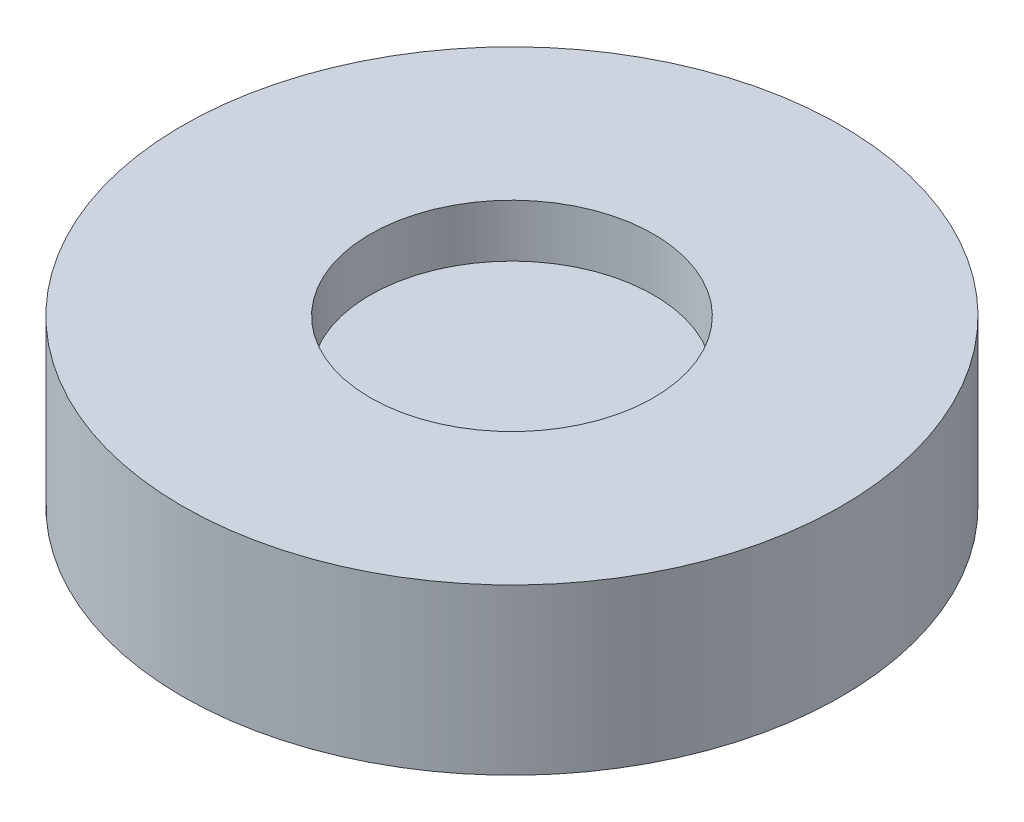
ISO-10303-21;
HEADER;
FILE_DESCRIPTION(('STEP AP214'),'2;1');
FILE_NAME('part.step','',(''),(''),'','','');
FILE_SCHEMA(('AUTOMOTIVE_DESIGN { 1 0 10303 214 1 1 1 1 }'));
ENDSEC;
DATA;
#1=APPLICATION_CONTEXT('core data for automotive mechanical design processes');
#2=APPLICATION_PROTOCOL_DEFINITION('international standard','automotive_design',2000,#1);
#3=PRODUCT_CONTEXT('',#1,'mechanical');
#4=PRODUCT('Part','Part','',(#3));
#5=PRODUCT_RELATED_PRODUCT_CATEGORY('part','',(#4));
#6=PRODUCT_DEFINITION_FORMATION('','',#4);
#7=PRODUCT_DEFINITION_CONTEXT('part definition',#1,'design');
#8=PRODUCT_DEFINITION('design','',#6,#7);
#9=PRODUCT_DEFINITION_SHAPE('','',#8);
#10=(LENGTH_UNIT() NAMED_UNIT(*) SI_UNIT(.MILLI.,.METRE.));
#11=(NAMED_UNIT(*) PLANE_ANGLE_UNIT() SI_UNIT($,.RADIAN.));
#12=(NAMED_UNIT(*) SI_UNIT($,.STERADIAN.) SOLID_ANGLE_UNIT());
#13=UNCERTAINTY_MEASURE_WITH_UNIT(LENGTH_MEASURE(1.E-05),#10,'distance_accuracy_value','');
#14=(GEOMETRIC_REPRESENTATION_CONTEXT(3) GLOBAL_UNCERTAINTY_ASSIGNED_CONTEXT((#13)) GLOBAL_UNIT_ASSIGNED_CONTEXT((#10,
#11,#12)) REPRESENTATION_CONTEXT('',''));
#15=CARTESIAN_POINT('',(0.,0.,0.));
#16=DIRECTION('',(0.,0.,1.));
#17=DIRECTION('',(1.,0.,0.));
#18=AXIS2_PLACEMENT_3D('',#15,#16,#17);
#19=CARTESIAN_POINT('',(0.,10.,0.));
#20=DIRECTION('',(0.,-1.,0.));
#21=DIRECTION('',(0.,0.,-1.));
#22=AXIS2_PLACEMENT_3D('',#19,#20,#21);
#23=CYLINDRICAL_SURFACE('',#22,20.);
#24=CARTESIAN_POINT('',(0.,10.,0.));
#25=DIRECTION('',(0.,1.,0.));
#26=DIRECTION('',(0.,0.,1.));
#27=AXIS2_PLACEMENT_3D('',#24,#25,#26);
#28=CIRCLE('',#27,20.);
#29=CARTESIAN_POINT('',(0.,10.,20.));
#30=VERTEX_POINT('',#29);
#31=EDGE_CURVE('E10',#30,#30,#28,.T.);
#32=ORIENTED_EDGE('',*,*,#31,.F.);
#33=EDGE_LOOP('',(#32));
#34=FACE_BOUND('',#33,.T.);
#35=CARTESIAN_POINT('',(0.,0.,0.));
#36=DIRECTION('',(0.,1.,0.));
#37=DIRECTION('',(0.,0.,1.));
#38=AXIS2_PLACEMENT_3D('',#35,#36,#37);
#39=CIRCLE('',#38,20.);
#40=CARTESIAN_POINT('',(0.,0.,20.));
#41=VERTEX_POINT('',#40);
#42=EDGE_CURVE('E34',#41,#41,#39,.T.);
#43=ORIENTED_EDGE('',*,*,#42,.T.);
#44=EDGE_LOOP('',(#43));
#45=FACE_BOUND('',#44,.T.);
#46=ADVANCED_FACE('F31',(#34,#45),#23,.T.);
#47=CARTESIAN_POINT('',(0.,10.,0.));
#48=DIRECTION('',(0.,1.,0.));
#49=DIRECTION('',(0.,0.,1.));
#50=AXIS2_PLACEMENT_3D('',#47,#48,#49);
#51=PLANE('',#50);
#52=CARTESIAN_POINT('',(0.,10.,0.));
#53=DIRECTION('',(0.,1.,0.));
#54=DIRECTION('',(0.,0.,1.));
#55=AXIS2_PLACEMENT_3D('',#52,#53,#54);
#56=CIRCLE('',#55,8.6);
#57=CARTESIAN_POINT('',(0.,10.,8.6));
#58=VERTEX_POINT('',#57);
#59=EDGE_CURVE('E43',#58,#58,#56,.T.);
#60=ORIENTED_EDGE('',*,*,#59,.F.);
#61=EDGE_LOOP('',(#60));
#62=FACE_BOUND('',#61,.T.);
#63=ORIENTED_EDGE('',*,*,#31,.T.);
#64=EDGE_LOOP('',(#63));
#65=FACE_BOUND('',#64,.T.);
#66=ADVANCED_FACE('F68',(#62,#65),#51,.T.);
#67=CARTESIAN_POINT('',(0.,0.,0.));
#68=DIRECTION('',(0.,1.,0.));
#69=DIRECTION('',(0.,0.,1.));
#70=AXIS2_PLACEMENT_3D('',#67,#68,#69);
#71=PLANE('',#70);
#72=CARTESIAN_POINT('',(0.,0.,0.));
#73=DIRECTION('',(0.,-1.,0.));
#74=DIRECTION('',(0.,0.,-1.));
#75=AXIS2_PLACEMENT_3D('',#72,#73,#74);
#76=CIRCLE('',#75,8.25);
#77=CARTESIAN_POINT('',(0.,0.,-8.25));
#78=VERTEX_POINT('',#77);
#79=EDGE_CURVE('E49',#78,#78,#76,.T.);
#80=ORIENTED_EDGE('',*,*,#79,.F.);
#81=EDGE_LOOP('',(#80));
#82=FACE_BOUND('',#81,.T.);
#83=ORIENTED_EDGE('',*,*,#42,.F.);
#84=EDGE_LOOP('',(#83));
#85=FACE_BOUND('',#84,.T.);
#86=ADVANCED_FACE('F64',(#82,#85),#71,.F.);
#87=CARTESIAN_POINT('',(0.,6.8,0.));
#88=DIRECTION('',(0.,1.,0.));
#89=DIRECTION('',(0.,0.,1.));
#90=AXIS2_PLACEMENT_3D('',#87,#88,#89);
#91=CYLINDRICAL_SURFACE('',#90,8.6);
#92=CARTESIAN_POINT('',(0.,6.8,0.));
#93=DIRECTION('',(0.,1.,0.));
#94=DIRECTION('',(0.,0.,1.));
#95=AXIS2_PLACEMENT_3D('',#92,#93,#94);
#96=CIRCLE('',#95,8.6);
#97=CARTESIAN_POINT('',(0.,6.8,8.6));
#98=VERTEX_POINT('',#97);
#99=EDGE_CURVE('E41',#98,#98,#96,.T.);
#100=ORIENTED_EDGE('',*,*,#99,.F.);
#101=EDGE_LOOP('',(#100));
#102=FACE_BOUND('',#101,.T.);
#103=ORIENTED_EDGE('',*,*,#59,.T.);
#104=EDGE_LOOP('',(#103));
#105=FACE_BOUND('',#104,.T.);
#106=ADVANCED_FACE('F67',(#102,#105),#91,.F.);
#107=CARTESIAN_POINT('',(0.,6.8,0.));
#108=DIRECTION('',(0.,1.,0.));
#109=DIRECTION('',(0.,0.,1.));
#110=AXIS2_PLACEMENT_3D('',#107,#108,#109);
#111=PLANE('',#110);
#112=ORIENTED_EDGE('',*,*,#99,.T.);
#113=EDGE_LOOP('',(#112));
#114=FACE_BOUND('',#113,.T.);
#115=ADVANCED_FACE('F60',(#114),#111,.T.);
#116=CARTESIAN_POINT('',(0.,1.8,0.));
#117=DIRECTION('',(0.,-1.,0.));
#118=DIRECTION('',(0.,0.,-1.));
#119=AXIS2_PLACEMENT_3D('',#116,#117,#118);
#120=CYLINDRICAL_SURFACE('',#119,8.25);
#121=CARTESIAN_POINT('',(0.,1.8,0.));
#122=DIRECTION('',(0.,-1.,0.));
#123=DIRECTION('',(0.,0.,-1.));
#124=AXIS2_PLACEMENT_3D('',#121,#122,#123);
#125=CIRCLE('',#124,8.25);
#126=CARTESIAN_POINT('',(0.,1.8,-8.25));
#127=VERTEX_POINT('',#126);
#128=EDGE_CURVE('E46',#127,#127,#125,.T.);
#129=ORIENTED_EDGE('',*,*,#128,.F.);
#130=EDGE_LOOP('',(#129));
#131=FACE_BOUND('',#130,.T.);
#132=ORIENTED_EDGE('',*,*,#79,.T.);
#133=EDGE_LOOP('',(#132));
#134=FACE_BOUND('',#133,.T.);
#135=ADVANCED_FACE('F57',(#131,#134),#120,.F.);
#136=CARTESIAN_POINT('',(0.,1.8,0.));
#137=DIRECTION('',(0.,-1.,0.));
#138=DIRECTION('',(0.,0.,-1.));
#139=AXIS2_PLACEMENT_3D('',#136,#137,#138);
#140=PLANE('',#139);
#141=ORIENTED_EDGE('',*,*,#128,.T.);
#142=EDGE_LOOP('',(#141));
#143=FACE_BOUND('',#142,.T.);
#144=ADVANCED_FACE('F55',(#143),#140,.T.);
#145=CLOSED_SHELL('',(#46,#66,#86,#106,#115,#135,#144));
#146=MANIFOLD_SOLID_BREP('B2',#145);
#147=ADVANCED_BREP_SHAPE_REPRESENTATION('',(#18,#146),#14);
#148=SHAPE_DEFINITION_REPRESENTATION(#9,#147);
ENDSEC;
END-ISO-10303-21;
